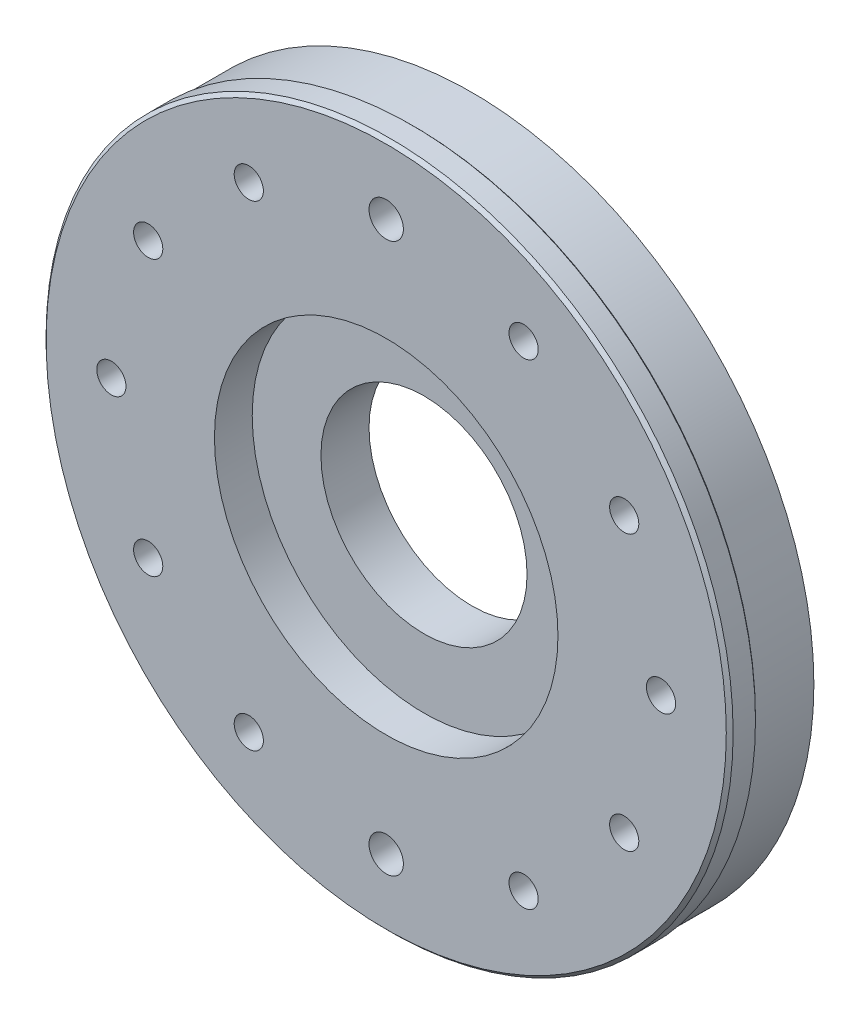
ISO-10303-21;
HEADER;
FILE_DESCRIPTION(('STEP AP214'),'2;1');
FILE_NAME('part.step','',(''),(''),'','','');
FILE_SCHEMA(('AUTOMOTIVE_DESIGN { 1 0 10303 214 1 1 1 1 }'));
ENDSEC;
DATA;
#1=APPLICATION_CONTEXT('core data for automotive mechanical design processes');
#2=APPLICATION_PROTOCOL_DEFINITION('international standard','automotive_design',2000,#1);
#3=PRODUCT_CONTEXT('',#1,'mechanical');
#4=PRODUCT('Part','Part','',(#3));
#5=PRODUCT_RELATED_PRODUCT_CATEGORY('part','',(#4));
#6=PRODUCT_DEFINITION_FORMATION('','',#4);
#7=PRODUCT_DEFINITION_CONTEXT('part definition',#1,'design');
#8=PRODUCT_DEFINITION('design','',#6,#7);
#9=PRODUCT_DEFINITION_SHAPE('','',#8);
#10=(LENGTH_UNIT() NAMED_UNIT(*) SI_UNIT(.MILLI.,.METRE.));
#11=(NAMED_UNIT(*) PLANE_ANGLE_UNIT() SI_UNIT($,.RADIAN.));
#12=(NAMED_UNIT(*) SI_UNIT($,.STERADIAN.) SOLID_ANGLE_UNIT());
#13=UNCERTAINTY_MEASURE_WITH_UNIT(LENGTH_MEASURE(1.E-05),#10,'distance_accuracy_value','');
#14=(GEOMETRIC_REPRESENTATION_CONTEXT(3) GLOBAL_UNCERTAINTY_ASSIGNED_CONTEXT((#13)) GLOBAL_UNIT_ASSIGNED_CONTEXT((#10,
#11,#12)) REPRESENTATION_CONTEXT('',''));
#15=CARTESIAN_POINT('',(0.,0.,0.));
#16=DIRECTION('',(0.,0.,1.));
#17=DIRECTION('',(1.,0.,0.));
#18=AXIS2_PLACEMENT_3D('',#15,#16,#17);
#19=CARTESIAN_POINT('',(0.,0.,-8.));
#20=DIRECTION('',(0.,0.,1.));
#21=DIRECTION('',(1.,0.,0.));
#22=AXIS2_PLACEMENT_3D('',#19,#20,#21);
#23=CYLINDRICAL_SURFACE('',#22,100.);
#24=CARTESIAN_POINT('',(0.,0.,-7.49999999999999));
#25=DIRECTION('',(0.,0.,1.));
#26=DIRECTION('',(1.,0.,0.));
#27=AXIS2_PLACEMENT_3D('',#24,#25,#26);
#28=CIRCLE('',#27,100.);
#29=CARTESIAN_POINT('',(100.,0.,-7.49999999999999));
#30=VERTEX_POINT('',#29);
#31=EDGE_CURVE('E11',#30,#30,#28,.T.);
#32=ORIENTED_EDGE('',*,*,#31,.T.);
#33=EDGE_LOOP('',(#32));
#34=FACE_BOUND('',#33,.T.);
#35=CARTESIAN_POINT('',(0.,0.,-1.));
#36=DIRECTION('',(0.,0.,1.));
#37=DIRECTION('',(1.,0.,0.));
#38=AXIS2_PLACEMENT_3D('',#35,#36,#37);
#39=CIRCLE('',#38,100.);
#40=CARTESIAN_POINT('',(100.,0.,-1.));
#41=VERTEX_POINT('',#40);
#42=EDGE_CURVE('E46',#41,#41,#39,.F.);
#43=ORIENTED_EDGE('',*,*,#42,.T.);
#44=EDGE_LOOP('',(#43));
#45=FACE_BOUND('',#44,.T.);
#46=ADVANCED_FACE('F38',(#34,#45),#23,.T.);
#47=CARTESIAN_POINT('',(0.,0.,0.));
#48=DIRECTION('',(0.,0.,1.));
#49=DIRECTION('',(1.,0.,0.));
#50=AXIS2_PLACEMENT_3D('',#47,#48,#49);
#51=PLANE('',#50);
#52=CARTESIAN_POINT('',(-69.2820323027556,39.9999999999991,0.));
#53=DIRECTION('',(0.,0.,1.));
#54=DIRECTION('',(1.,0.,0.));
#55=AXIS2_PLACEMENT_3D('',#52,#53,#54);
#56=CIRCLE('',#55,4.25);
#57=CARTESIAN_POINT('',(-65.0320323027556,39.9999999999991,0.));
#58=VERTEX_POINT('',#57);
#59=EDGE_CURVE('E142',#58,#58,#56,.T.);
#60=ORIENTED_EDGE('',*,*,#59,.F.);
#61=EDGE_LOOP('',(#60));
#62=FACE_BOUND('',#61,.T.);
#63=CARTESIAN_POINT('',(-40.0000000000008,69.2820323027546,0.));
#64=DIRECTION('',(0.,0.,1.));
#65=DIRECTION('',(1.,0.,0.));
#66=AXIS2_PLACEMENT_3D('',#63,#64,#65);
#67=CIRCLE('',#66,4.25);
#68=CARTESIAN_POINT('',(-35.7500000000008,69.2820323027546,0.));
#69=VERTEX_POINT('',#68);
#70=EDGE_CURVE('E132',#69,#69,#67,.T.);
#71=ORIENTED_EDGE('',*,*,#70,.F.);
#72=EDGE_LOOP('',(#71));
#73=FACE_BOUND('',#72,.T.);
#74=CARTESIAN_POINT('',(39.9999999999994,69.2820323027555,0.));
#75=DIRECTION('',(0.,0.,1.));
#76=DIRECTION('',(1.,0.,0.));
#77=AXIS2_PLACEMENT_3D('',#74,#75,#76);
#78=CIRCLE('',#77,4.25);
#79=CARTESIAN_POINT('',(44.2499999999994,69.2820323027555,0.));
#80=VERTEX_POINT('',#79);
#81=EDGE_CURVE('E129',#80,#80,#78,.T.);
#82=ORIENTED_EDGE('',*,*,#81,.F.);
#83=EDGE_LOOP('',(#82));
#84=FACE_BOUND('',#83,.T.);
#85=CARTESIAN_POINT('',(69.2820323027548,40.0000000000006,0.));
#86=DIRECTION('',(0.,0.,1.));
#87=DIRECTION('',(1.,0.,0.));
#88=AXIS2_PLACEMENT_3D('',#85,#86,#87);
#89=CIRCLE('',#88,4.25);
#90=CARTESIAN_POINT('',(73.5320323027548,40.0000000000006,0.));
#91=VERTEX_POINT('',#90);
#92=EDGE_CURVE('E126',#91,#91,#89,.T.);
#93=ORIENTED_EDGE('',*,*,#92,.F.);
#94=EDGE_LOOP('',(#93));
#95=FACE_BOUND('',#94,.T.);
#96=CARTESIAN_POINT('',(80.,5.58637337777501E-13,0.));
#97=DIRECTION('',(0.,0.,1.));
#98=DIRECTION('',(1.,0.,0.));
#99=AXIS2_PLACEMENT_3D('',#96,#97,#98);
#100=CIRCLE('',#99,4.25);
#101=CARTESIAN_POINT('',(84.25,5.58637337777501E-13,0.));
#102=VERTEX_POINT('',#101);
#103=EDGE_CURVE('E122',#102,#102,#100,.T.);
#104=ORIENTED_EDGE('',*,*,#103,.F.);
#105=EDGE_LOOP('',(#104));
#106=FACE_BOUND('',#105,.T.);
#107=CARTESIAN_POINT('',(69.2820323027553,-39.9999999999996,0.));
#108=DIRECTION('',(0.,0.,1.));
#109=DIRECTION('',(1.,0.,0.));
#110=AXIS2_PLACEMENT_3D('',#107,#108,#109);
#111=CIRCLE('',#110,4.25);
#112=CARTESIAN_POINT('',(73.5320323027553,-39.9999999999996,0.));
#113=VERTEX_POINT('',#112);
#114=EDGE_CURVE('E118',#113,#113,#111,.T.);
#115=ORIENTED_EDGE('',*,*,#114,.F.);
#116=EDGE_LOOP('',(#115));
#117=FACE_BOUND('',#116,.T.);
#118=CARTESIAN_POINT('',(40.0000000000003,-69.2820323027549,0.));
#119=DIRECTION('',(0.,0.,1.));
#120=DIRECTION('',(1.,0.,0.));
#121=AXIS2_PLACEMENT_3D('',#118,#119,#120);
#122=CIRCLE('',#121,4.25);
#123=CARTESIAN_POINT('',(44.2500000000003,-69.2820323027549,0.));
#124=VERTEX_POINT('',#123);
#125=EDGE_CURVE('E114',#124,#124,#122,.T.);
#126=ORIENTED_EDGE('',*,*,#125,.F.);
#127=EDGE_LOOP('',(#126));
#128=FACE_BOUND('',#127,.T.);
#129=CARTESIAN_POINT('',(-39.9999999999998,-69.2820323027552,0.));
#130=DIRECTION('',(0.,0.,1.));
#131=DIRECTION('',(1.,0.,0.));
#132=AXIS2_PLACEMENT_3D('',#129,#130,#131);
#133=CIRCLE('',#132,4.25);
#134=CARTESIAN_POINT('',(-35.7499999999998,-69.2820323027552,0.));
#135=VERTEX_POINT('',#134);
#136=EDGE_CURVE('E110',#135,#135,#133,.T.);
#137=ORIENTED_EDGE('',*,*,#136,.F.);
#138=EDGE_LOOP('',(#137));
#139=FACE_BOUND('',#138,.T.);
#140=CARTESIAN_POINT('',(-69.2820323027551,-40.0000000000001,0.));
#141=DIRECTION('',(0.,0.,1.));
#142=DIRECTION('',(1.,0.,0.));
#143=AXIS2_PLACEMENT_3D('',#140,#141,#142);
#144=CIRCLE('',#143,4.25);
#145=CARTESIAN_POINT('',(-65.032032302755,-40.0000000000001,0.));
#146=VERTEX_POINT('',#145);
#147=EDGE_CURVE('E106',#146,#146,#144,.T.);
#148=ORIENTED_EDGE('',*,*,#147,.F.);
#149=EDGE_LOOP('',(#148));
#150=FACE_BOUND('',#149,.T.);
#151=CARTESIAN_POINT('',(-80.,0.,0.));
#152=DIRECTION('',(0.,0.,1.));
#153=DIRECTION('',(1.,0.,0.));
#154=AXIS2_PLACEMENT_3D('',#151,#152,#153);
#155=CIRCLE('',#154,4.25);
#156=CARTESIAN_POINT('',(-75.75,0.,0.));
#157=VERTEX_POINT('',#156);
#158=EDGE_CURVE('E70',#157,#157,#155,.T.);
#159=ORIENTED_EDGE('',*,*,#158,.F.);
#160=EDGE_LOOP('',(#159));
#161=FACE_BOUND('',#160,.T.);
#162=CARTESIAN_POINT('',(0.,80.,0.));
#163=DIRECTION('',(0.,0.,1.));
#164=DIRECTION('',(1.,0.,0.));
#165=AXIS2_PLACEMENT_3D('',#162,#163,#164);
#166=CIRCLE('',#165,5.);
#167=CARTESIAN_POINT('',(5.,80.,0.));
#168=VERTEX_POINT('',#167);
#169=EDGE_CURVE('E63',#168,#168,#166,.T.);
#170=ORIENTED_EDGE('',*,*,#169,.F.);
#171=EDGE_LOOP('',(#170));
#172=FACE_BOUND('',#171,.T.);
#173=CARTESIAN_POINT('',(0.,-80.,0.));
#174=DIRECTION('',(0.,0.,1.));
#175=DIRECTION('',(1.,0.,0.));
#176=AXIS2_PLACEMENT_3D('',#173,#174,#175);
#177=CIRCLE('',#176,5.);
#178=CARTESIAN_POINT('',(5.,-80.,0.));
#179=VERTEX_POINT('',#178);
#180=EDGE_CURVE('E77',#179,#179,#177,.T.);
#181=ORIENTED_EDGE('',*,*,#180,.F.);
#182=EDGE_LOOP('',(#181));
#183=FACE_BOUND('',#182,.T.);
#184=CARTESIAN_POINT('',(0.,0.,0.));
#185=DIRECTION('',(0.,0.,1.));
#186=DIRECTION('',(1.,0.,0.));
#187=AXIS2_PLACEMENT_3D('',#184,#185,#186);
#188=CIRCLE('',#187,50.);
#189=CARTESIAN_POINT('',(50.,0.,0.));
#190=VERTEX_POINT('',#189);
#191=EDGE_CURVE('E86',#190,#190,#188,.T.);
#192=ORIENTED_EDGE('',*,*,#191,.F.);
#193=EDGE_LOOP('',(#192));
#194=FACE_BOUND('',#193,.T.);
#195=CARTESIAN_POINT('',(0.,0.,0.));
#196=DIRECTION('',(0.,0.,1.));
#197=DIRECTION('',(1.,0.,0.));
#198=AXIS2_PLACEMENT_3D('',#195,#196,#197);
#199=CIRCLE('',#198,99.);
#200=CARTESIAN_POINT('',(99.,0.,0.));
#201=VERTEX_POINT('',#200);
#202=EDGE_CURVE('E98',#201,#201,#199,.T.);
#203=ORIENTED_EDGE('',*,*,#202,.T.);
#204=EDGE_LOOP('',(#203));
#205=FACE_BOUND('',#204,.T.);
#206=ADVANCED_FACE('F159',(#62,#73,#84,#95,#106,#117,#128,#139,#150,#161,#172,#183,#194,#205),
#51,.T.);
#207=CARTESIAN_POINT('',(0.,0.,-25.));
#208=DIRECTION('',(0.,0.,1.));
#209=DIRECTION('',(1.,0.,0.));
#210=AXIS2_PLACEMENT_3D('',#207,#208,#209);
#211=CYLINDRICAL_SURFACE('',#210,99.5);
#212=CARTESIAN_POINT('',(0.,0.,-25.));
#213=DIRECTION('',(0.,0.,-1.));
#214=DIRECTION('',(-1.,0.,0.));
#215=AXIS2_PLACEMENT_3D('',#212,#213,#214);
#216=CIRCLE('',#215,99.5);
#217=CARTESIAN_POINT('',(-99.5,0.,-25.));
#218=VERTEX_POINT('',#217);
#219=EDGE_CURVE('E92',#218,#218,#216,.T.);
#220=ORIENTED_EDGE('',*,*,#219,.F.);
#221=EDGE_LOOP('',(#220));
#222=FACE_BOUND('',#221,.T.);
#223=CARTESIAN_POINT('',(0.,0.,-8.));
#224=DIRECTION('',(0.,0.,1.));
#225=DIRECTION('',(1.,0.,0.));
#226=AXIS2_PLACEMENT_3D('',#223,#224,#225);
#227=CIRCLE('',#226,99.5);
#228=CARTESIAN_POINT('',(99.5,0.,-8.));
#229=VERTEX_POINT('',#228);
#230=EDGE_CURVE('E95',#229,#229,#227,.F.);
#231=ORIENTED_EDGE('',*,*,#230,.T.);
#232=EDGE_LOOP('',(#231));
#233=FACE_BOUND('',#232,.T.);
#234=ADVANCED_FACE('F162',(#222,#233),#211,.T.);
#235=CARTESIAN_POINT('',(0.,0.,-25.));
#236=DIRECTION('',(0.,0.,-1.));
#237=DIRECTION('',(-1.,0.,0.));
#238=AXIS2_PLACEMENT_3D('',#235,#236,#237);
#239=PLANE('',#238);
#240=CARTESIAN_POINT('',(-69.2820323027556,39.9999999999991,-25.));
#241=DIRECTION('',(0.,0.,-1.));
#242=DIRECTION('',(-1.,0.,0.));
#243=AXIS2_PLACEMENT_3D('',#240,#241,#242);
#244=CIRCLE('',#243,4.25);
#245=CARTESIAN_POINT('',(-73.5320323027556,39.9999999999991,-25.));
#246=VERTEX_POINT('',#245);
#247=EDGE_CURVE('E41',#246,#246,#244,.T.);
#248=ORIENTED_EDGE('',*,*,#247,.F.);
#249=EDGE_LOOP('',(#248));
#250=FACE_BOUND('',#249,.T.);
#251=CARTESIAN_POINT('',(-40.0000000000008,69.2820323027546,-25.));
#252=DIRECTION('',(0.,0.,-1.));
#253=DIRECTION('',(-1.,0.,0.));
#254=AXIS2_PLACEMENT_3D('',#251,#252,#253);
#255=CIRCLE('',#254,4.25);
#256=CARTESIAN_POINT('',(-44.2500000000008,69.2820323027546,-25.));
#257=VERTEX_POINT('',#256);
#258=EDGE_CURVE('E130',#257,#257,#255,.T.);
#259=ORIENTED_EDGE('',*,*,#258,.F.);
#260=EDGE_LOOP('',(#259));
#261=FACE_BOUND('',#260,.T.);
#262=CARTESIAN_POINT('',(39.9999999999994,69.2820323027555,-25.));
#263=DIRECTION('',(0.,0.,-1.));
#264=DIRECTION('',(-1.,0.,0.));
#265=AXIS2_PLACEMENT_3D('',#262,#263,#264);
#266=CIRCLE('',#265,4.25);
#267=CARTESIAN_POINT('',(35.7499999999994,69.2820323027555,-25.));
#268=VERTEX_POINT('',#267);
#269=EDGE_CURVE('E127',#268,#268,#266,.T.);
#270=ORIENTED_EDGE('',*,*,#269,.F.);
#271=EDGE_LOOP('',(#270));
#272=FACE_BOUND('',#271,.T.);
#273=CARTESIAN_POINT('',(69.2820323027548,40.0000000000006,-25.));
#274=DIRECTION('',(0.,0.,-1.));
#275=DIRECTION('',(-1.,0.,0.));
#276=AXIS2_PLACEMENT_3D('',#273,#274,#275);
#277=CIRCLE('',#276,4.25);
#278=CARTESIAN_POINT('',(65.0320323027548,40.0000000000006,-25.));
#279=VERTEX_POINT('',#278);
#280=EDGE_CURVE('E123',#279,#279,#277,.T.);
#281=ORIENTED_EDGE('',*,*,#280,.F.);
#282=EDGE_LOOP('',(#281));
#283=FACE_BOUND('',#282,.T.);
#284=CARTESIAN_POINT('',(80.,5.58637337777501E-13,-25.));
#285=DIRECTION('',(0.,0.,-1.));
#286=DIRECTION('',(-1.,0.,0.));
#287=AXIS2_PLACEMENT_3D('',#284,#285,#286);
#288=CIRCLE('',#287,4.25);
#289=CARTESIAN_POINT('',(75.75,5.58637337777501E-13,-25.));
#290=VERTEX_POINT('',#289);
#291=EDGE_CURVE('E119',#290,#290,#288,.T.);
#292=ORIENTED_EDGE('',*,*,#291,.F.);
#293=EDGE_LOOP('',(#292));
#294=FACE_BOUND('',#293,.T.);
#295=CARTESIAN_POINT('',(69.2820323027553,-39.9999999999996,-25.));
#296=DIRECTION('',(0.,0.,-1.));
#297=DIRECTION('',(-1.,0.,0.));
#298=AXIS2_PLACEMENT_3D('',#295,#296,#297);
#299=CIRCLE('',#298,4.25);
#300=CARTESIAN_POINT('',(65.0320323027553,-39.9999999999996,-25.));
#301=VERTEX_POINT('',#300);
#302=EDGE_CURVE('E115',#301,#301,#299,.T.);
#303=ORIENTED_EDGE('',*,*,#302,.F.);
#304=EDGE_LOOP('',(#303));
#305=FACE_BOUND('',#304,.T.);
#306=CARTESIAN_POINT('',(40.0000000000003,-69.2820323027549,-25.));
#307=DIRECTION('',(0.,0.,-1.));
#308=DIRECTION('',(-1.,0.,0.));
#309=AXIS2_PLACEMENT_3D('',#306,#307,#308);
#310=CIRCLE('',#309,4.25);
#311=CARTESIAN_POINT('',(35.7500000000003,-69.2820323027549,-25.));
#312=VERTEX_POINT('',#311);
#313=EDGE_CURVE('E111',#312,#312,#310,.T.);
#314=ORIENTED_EDGE('',*,*,#313,.F.);
#315=EDGE_LOOP('',(#314));
#316=FACE_BOUND('',#315,.T.);
#317=CARTESIAN_POINT('',(-39.9999999999998,-69.2820323027552,-25.));
#318=DIRECTION('',(0.,0.,-1.));
#319=DIRECTION('',(-1.,0.,0.));
#320=AXIS2_PLACEMENT_3D('',#317,#318,#319);
#321=CIRCLE('',#320,4.25);
#322=CARTESIAN_POINT('',(-44.2499999999998,-69.2820323027552,-25.));
#323=VERTEX_POINT('',#322);
#324=EDGE_CURVE('E107',#323,#323,#321,.T.);
#325=ORIENTED_EDGE('',*,*,#324,.F.);
#326=EDGE_LOOP('',(#325));
#327=FACE_BOUND('',#326,.T.);
#328=CARTESIAN_POINT('',(-69.2820323027551,-40.0000000000001,-25.));
#329=DIRECTION('',(0.,0.,-1.));
#330=DIRECTION('',(-1.,0.,0.));
#331=AXIS2_PLACEMENT_3D('',#328,#329,#330);
#332=CIRCLE('',#331,4.25);
#333=CARTESIAN_POINT('',(-73.532032302755,-40.0000000000001,-25.));
#334=VERTEX_POINT('',#333);
#335=EDGE_CURVE('E103',#334,#334,#332,.T.);
#336=ORIENTED_EDGE('',*,*,#335,.F.);
#337=EDGE_LOOP('',(#336));
#338=FACE_BOUND('',#337,.T.);
#339=CARTESIAN_POINT('',(-80.,0.,-25.));
#340=DIRECTION('',(0.,0.,-1.));
#341=DIRECTION('',(-1.,0.,0.));
#342=AXIS2_PLACEMENT_3D('',#339,#340,#341);
#343=CIRCLE('',#342,4.25);
#344=CARTESIAN_POINT('',(-84.25,0.,-25.));
#345=VERTEX_POINT('',#344);
#346=EDGE_CURVE('E64',#345,#345,#343,.T.);
#347=ORIENTED_EDGE('',*,*,#346,.F.);
#348=EDGE_LOOP('',(#347));
#349=FACE_BOUND('',#348,.T.);
#350=CARTESIAN_POINT('',(0.,0.,-25.));
#351=DIRECTION('',(0.,0.,1.));
#352=DIRECTION('',(1.,0.,0.));
#353=AXIS2_PLACEMENT_3D('',#350,#351,#352);
#354=CIRCLE('',#353,30.);
#355=CARTESIAN_POINT('',(30.,0.,-25.));
#356=VERTEX_POINT('',#355);
#357=EDGE_CURVE('E83',#356,#356,#354,.T.);
#358=ORIENTED_EDGE('',*,*,#357,.T.);
#359=EDGE_LOOP('',(#358));
#360=FACE_BOUND('',#359,.T.);
#361=ORIENTED_EDGE('',*,*,#219,.T.);
#362=EDGE_LOOP('',(#361));
#363=FACE_BOUND('',#362,.T.);
#364=ADVANCED_FACE('F178',(#250,#261,#272,#283,#294,#305,#316,#327,#338,#349,#360,#363),#239,.T.);
#365=CARTESIAN_POINT('',(0.,0.,0.));
#366=DIRECTION('',(0.,0.,-1.));
#367=DIRECTION('',(-1.,0.,0.));
#368=AXIS2_PLACEMENT_3D('',#365,#366,#367);
#369=CONICAL_SURFACE('',#368,99.,0.785398163397448);
#370=ORIENTED_EDGE('',*,*,#42,.F.);
#371=EDGE_LOOP('',(#370));
#372=FACE_BOUND('',#371,.T.);
#373=ORIENTED_EDGE('',*,*,#202,.F.);
#374=EDGE_LOOP('',(#373));
#375=FACE_BOUND('',#374,.T.);
#376=ADVANCED_FACE('F175',(#372,#375),#369,.T.);
#377=CARTESIAN_POINT('',(0.,0.,-7.49999999999999));
#378=DIRECTION('',(0.,0.,1.));
#379=DIRECTION('',(1.,0.,0.));
#380=AXIS2_PLACEMENT_3D('',#377,#378,#379);
#381=CONICAL_SURFACE('',#380,100.,0.785398163397441);
#382=ORIENTED_EDGE('',*,*,#230,.F.);
#383=EDGE_LOOP('',(#382));
#384=FACE_BOUND('',#383,.T.);
#385=ORIENTED_EDGE('',*,*,#31,.F.);
#386=EDGE_LOOP('',(#385));
#387=FACE_BOUND('',#386,.T.);
#388=ADVANCED_FACE('F177',(#384,#387),#381,.T.);
#389=CARTESIAN_POINT('',(0.,0.,-11.));
#390=DIRECTION('',(0.,0.,1.));
#391=DIRECTION('',(1.,0.,0.));
#392=AXIS2_PLACEMENT_3D('',#389,#390,#391);
#393=CYLINDRICAL_SURFACE('',#392,50.);
#394=CARTESIAN_POINT('',(0.,0.,-11.));
#395=DIRECTION('',(0.,0.,1.));
#396=DIRECTION('',(1.,0.,0.));
#397=AXIS2_PLACEMENT_3D('',#394,#395,#396);
#398=CIRCLE('',#397,50.);
#399=CARTESIAN_POINT('',(50.,0.,-11.));
#400=VERTEX_POINT('',#399);
#401=EDGE_CURVE('E89',#400,#400,#398,.T.);
#402=ORIENTED_EDGE('',*,*,#401,.F.);
#403=EDGE_LOOP('',(#402));
#404=FACE_BOUND('',#403,.T.);
#405=ORIENTED_EDGE('',*,*,#191,.T.);
#406=EDGE_LOOP('',(#405));
#407=FACE_BOUND('',#406,.T.);
#408=ADVANCED_FACE('F185',(#404,#407),#393,.F.);
#409=CARTESIAN_POINT('',(0.,0.,-11.));
#410=DIRECTION('',(0.,0.,1.));
#411=DIRECTION('',(1.,0.,0.));
#412=AXIS2_PLACEMENT_3D('',#409,#410,#411);
#413=PLANE('',#412);
#414=CARTESIAN_POINT('',(0.,0.,-11.));
#415=DIRECTION('',(0.,0.,1.));
#416=DIRECTION('',(1.,0.,0.));
#417=AXIS2_PLACEMENT_3D('',#414,#415,#416);
#418=CIRCLE('',#417,30.);
#419=CARTESIAN_POINT('',(30.,0.,-11.));
#420=VERTEX_POINT('',#419);
#421=EDGE_CURVE('E80',#420,#420,#418,.T.);
#422=ORIENTED_EDGE('',*,*,#421,.F.);
#423=EDGE_LOOP('',(#422));
#424=FACE_BOUND('',#423,.T.);
#425=ORIENTED_EDGE('',*,*,#401,.T.);
#426=EDGE_LOOP('',(#425));
#427=FACE_BOUND('',#426,.T.);
#428=ADVANCED_FACE('F326',(#424,#427),#413,.T.);
#429=CARTESIAN_POINT('',(0.,0.,-25.));
#430=DIRECTION('',(0.,0.,1.));
#431=DIRECTION('',(1.,0.,0.));
#432=AXIS2_PLACEMENT_3D('',#429,#430,#431);
#433=CYLINDRICAL_SURFACE('',#432,30.);
#434=ORIENTED_EDGE('',*,*,#357,.F.);
#435=EDGE_LOOP('',(#434));
#436=FACE_BOUND('',#435,.T.);
#437=ORIENTED_EDGE('',*,*,#421,.T.);
#438=EDGE_LOOP('',(#437));
#439=FACE_BOUND('',#438,.T.);
#440=ADVANCED_FACE('F322',(#436,#439),#433,.F.);
#441=CARTESIAN_POINT('',(0.,-80.,0.));
#442=DIRECTION('',(0.,0.,1.));
#443=DIRECTION('',(1.,0.,0.));
#444=AXIS2_PLACEMENT_3D('',#441,#442,#443);
#445=CYLINDRICAL_SURFACE('',#444,5.);
#446=CARTESIAN_POINT('',(0.,-80.,-20.));
#447=DIRECTION('',(0.,0.,1.));
#448=DIRECTION('',(1.,0.,0.));
#449=AXIS2_PLACEMENT_3D('',#446,#447,#448);
#450=CIRCLE('',#449,5.);
#451=CARTESIAN_POINT('',(5.,-80.,-20.));
#452=VERTEX_POINT('',#451);
#453=EDGE_CURVE('E67',#452,#452,#450,.T.);
#454=ORIENTED_EDGE('',*,*,#453,.F.);
#455=EDGE_LOOP('',(#454));
#456=FACE_BOUND('',#455,.T.);
#457=ORIENTED_EDGE('',*,*,#180,.T.);
#458=EDGE_LOOP('',(#457));
#459=FACE_BOUND('',#458,.T.);
#460=ADVANCED_FACE('F319',(#456,#459),#445,.F.);
#461=CARTESIAN_POINT('',(0.,-80.,-20.));
#462=DIRECTION('',(0.,0.,1.));
#463=DIRECTION('',(1.,0.,0.));
#464=AXIS2_PLACEMENT_3D('',#461,#462,#463);
#465=CONICAL_SURFACE('',#464,5.,1.02974425867665);
#466=CARTESIAN_POINT('',(0.,-80.,-23.0043030951378));
#467=VERTEX_POINT('',#466);
#468=VERTEX_LOOP('',#467);
#469=FACE_BOUND('',#468,.T.);
#470=ORIENTED_EDGE('',*,*,#453,.T.);
#471=EDGE_LOOP('',(#470));
#472=FACE_BOUND('',#471,.T.);
#473=ADVANCED_FACE('F316',(#469,#472),#465,.F.);
#474=CARTESIAN_POINT('',(0.,80.,0.));
#475=DIRECTION('',(0.,0.,1.));
#476=DIRECTION('',(1.,0.,0.));
#477=AXIS2_PLACEMENT_3D('',#474,#475,#476);
#478=CYLINDRICAL_SURFACE('',#477,5.);
#479=CARTESIAN_POINT('',(0.,80.,-20.));
#480=DIRECTION('',(0.,0.,1.));
#481=DIRECTION('',(1.,0.,0.));
#482=AXIS2_PLACEMENT_3D('',#479,#480,#481);
#483=CIRCLE('',#482,5.);
#484=CARTESIAN_POINT('',(5.,80.,-20.));
#485=VERTEX_POINT('',#484);
#486=EDGE_CURVE('E61',#485,#485,#483,.T.);
#487=ORIENTED_EDGE('',*,*,#486,.F.);
#488=EDGE_LOOP('',(#487));
#489=FACE_BOUND('',#488,.T.);
#490=ORIENTED_EDGE('',*,*,#169,.T.);
#491=EDGE_LOOP('',(#490));
#492=FACE_BOUND('',#491,.T.);
#493=ADVANCED_FACE('F57',(#489,#492),#478,.F.);
#494=CARTESIAN_POINT('',(0.,80.,-20.));
#495=DIRECTION('',(0.,0.,1.));
#496=DIRECTION('',(1.,0.,0.));
#497=AXIS2_PLACEMENT_3D('',#494,#495,#496);
#498=CONICAL_SURFACE('',#497,5.,1.02974425867665);
#499=CARTESIAN_POINT('',(0.,80.,-23.0043030951378));
#500=VERTEX_POINT('',#499);
#501=VERTEX_LOOP('',#500);
#502=FACE_BOUND('',#501,.T.);
#503=ORIENTED_EDGE('',*,*,#486,.T.);
#504=EDGE_LOOP('',(#503));
#505=FACE_BOUND('',#504,.T.);
#506=ADVANCED_FACE('F53',(#502,#505),#498,.F.);
#507=CARTESIAN_POINT('',(-80.,0.,0.));
#508=DIRECTION('',(0.,0.,1.));
#509=DIRECTION('',(1.,0.,0.));
#510=AXIS2_PLACEMENT_3D('',#507,#508,#509);
#511=CYLINDRICAL_SURFACE('',#510,4.25);
#512=ORIENTED_EDGE('',*,*,#346,.T.);
#513=EDGE_LOOP('',(#512));
#514=FACE_BOUND('',#513,.T.);
#515=ORIENTED_EDGE('',*,*,#158,.T.);
#516=EDGE_LOOP('',(#515));
#517=FACE_BOUND('',#516,.T.);
#518=ADVANCED_FACE('F56',(#514,#517),#511,.F.);
#519=CARTESIAN_POINT('',(-69.2820323027551,-40.0000000000001,0.));
#520=DIRECTION('',(0.,0.,1.));
#521=DIRECTION('',(1.,0.,0.));
#522=AXIS2_PLACEMENT_3D('',#519,#520,#521);
#523=CYLINDRICAL_SURFACE('',#522,4.25);
#524=ORIENTED_EDGE('',*,*,#335,.T.);
#525=EDGE_LOOP('',(#524));
#526=FACE_BOUND('',#525,.T.);
#527=ORIENTED_EDGE('',*,*,#147,.T.);
#528=EDGE_LOOP('',(#527));
#529=FACE_BOUND('',#528,.T.);
#530=ADVANCED_FACE('F157',(#526,#529),#523,.F.);
#531=CARTESIAN_POINT('',(-39.9999999999998,-69.2820323027552,0.));
#532=DIRECTION('',(0.,0.,1.));
#533=DIRECTION('',(1.,0.,0.));
#534=AXIS2_PLACEMENT_3D('',#531,#532,#533);
#535=CYLINDRICAL_SURFACE('',#534,4.25);
#536=ORIENTED_EDGE('',*,*,#324,.T.);
#537=EDGE_LOOP('',(#536));
#538=FACE_BOUND('',#537,.T.);
#539=ORIENTED_EDGE('',*,*,#136,.T.);
#540=EDGE_LOOP('',(#539));
#541=FACE_BOUND('',#540,.T.);
#542=ADVANCED_FACE('F225',(#538,#541),#535,.F.);
#543=CARTESIAN_POINT('',(40.0000000000003,-69.2820323027549,0.));
#544=DIRECTION('',(0.,0.,1.));
#545=DIRECTION('',(1.,0.,0.));
#546=AXIS2_PLACEMENT_3D('',#543,#544,#545);
#547=CYLINDRICAL_SURFACE('',#546,4.25);
#548=ORIENTED_EDGE('',*,*,#313,.T.);
#549=EDGE_LOOP('',(#548));
#550=FACE_BOUND('',#549,.T.);
#551=ORIENTED_EDGE('',*,*,#125,.T.);
#552=EDGE_LOOP('',(#551));
#553=FACE_BOUND('',#552,.T.);
#554=ADVANCED_FACE('F237',(#550,#553),#547,.F.);
#555=CARTESIAN_POINT('',(69.2820323027553,-39.9999999999996,0.));
#556=DIRECTION('',(0.,0.,1.));
#557=DIRECTION('',(1.,0.,0.));
#558=AXIS2_PLACEMENT_3D('',#555,#556,#557);
#559=CYLINDRICAL_SURFACE('',#558,4.25);
#560=ORIENTED_EDGE('',*,*,#302,.T.);
#561=EDGE_LOOP('',(#560));
#562=FACE_BOUND('',#561,.T.);
#563=ORIENTED_EDGE('',*,*,#114,.T.);
#564=EDGE_LOOP('',(#563));
#565=FACE_BOUND('',#564,.T.);
#566=ADVANCED_FACE('F247',(#562,#565),#559,.F.);
#567=CARTESIAN_POINT('',(80.,5.58637337777501E-13,0.));
#568=DIRECTION('',(0.,0.,1.));
#569=DIRECTION('',(1.,0.,0.));
#570=AXIS2_PLACEMENT_3D('',#567,#568,#569);
#571=CYLINDRICAL_SURFACE('',#570,4.25);
#572=ORIENTED_EDGE('',*,*,#291,.T.);
#573=EDGE_LOOP('',(#572));
#574=FACE_BOUND('',#573,.T.);
#575=ORIENTED_EDGE('',*,*,#103,.T.);
#576=EDGE_LOOP('',(#575));
#577=FACE_BOUND('',#576,.T.);
#578=ADVANCED_FACE('F257',(#574,#577),#571,.F.);
#579=CARTESIAN_POINT('',(69.2820323027548,40.0000000000006,0.));
#580=DIRECTION('',(0.,0.,1.));
#581=DIRECTION('',(1.,0.,0.));
#582=AXIS2_PLACEMENT_3D('',#579,#580,#581);
#583=CYLINDRICAL_SURFACE('',#582,4.25);
#584=ORIENTED_EDGE('',*,*,#280,.T.);
#585=EDGE_LOOP('',(#584));
#586=FACE_BOUND('',#585,.T.);
#587=ORIENTED_EDGE('',*,*,#92,.T.);
#588=EDGE_LOOP('',(#587));
#589=FACE_BOUND('',#588,.T.);
#590=ADVANCED_FACE('F267',(#586,#589),#583,.F.);
#591=CARTESIAN_POINT('',(39.9999999999994,69.2820323027555,0.));
#592=DIRECTION('',(0.,0.,1.));
#593=DIRECTION('',(1.,0.,0.));
#594=AXIS2_PLACEMENT_3D('',#591,#592,#593);
#595=CYLINDRICAL_SURFACE('',#594,4.25);
#596=ORIENTED_EDGE('',*,*,#269,.T.);
#597=EDGE_LOOP('',(#596));
#598=FACE_BOUND('',#597,.T.);
#599=ORIENTED_EDGE('',*,*,#81,.T.);
#600=EDGE_LOOP('',(#599));
#601=FACE_BOUND('',#600,.T.);
#602=ADVANCED_FACE('F277',(#598,#601),#595,.F.);
#603=CARTESIAN_POINT('',(-40.0000000000008,69.2820323027546,0.));
#604=DIRECTION('',(0.,0.,1.));
#605=DIRECTION('',(1.,0.,0.));
#606=AXIS2_PLACEMENT_3D('',#603,#604,#605);
#607=CYLINDRICAL_SURFACE('',#606,4.25);
#608=ORIENTED_EDGE('',*,*,#258,.T.);
#609=EDGE_LOOP('',(#608));
#610=FACE_BOUND('',#609,.T.);
#611=ORIENTED_EDGE('',*,*,#70,.T.);
#612=EDGE_LOOP('',(#611));
#613=FACE_BOUND('',#612,.T.);
#614=ADVANCED_FACE('F287',(#610,#613),#607,.F.);
#615=CARTESIAN_POINT('',(-69.2820323027556,39.9999999999991,0.));
#616=DIRECTION('',(0.,0.,1.));
#617=DIRECTION('',(1.,0.,0.));
#618=AXIS2_PLACEMENT_3D('',#615,#616,#617);
#619=CYLINDRICAL_SURFACE('',#618,4.25);
#620=ORIENTED_EDGE('',*,*,#247,.T.);
#621=EDGE_LOOP('',(#620));
#622=FACE_BOUND('',#621,.T.);
#623=ORIENTED_EDGE('',*,*,#59,.T.);
#624=EDGE_LOOP('',(#623));
#625=FACE_BOUND('',#624,.T.);
#626=ADVANCED_FACE('F297',(#622,#625),#619,.F.);
#627=CLOSED_SHELL('',(#46,#206,#234,#364,#376,#388,#408,#428,#440,#460,#473,#493,#506,#518,#530,
#542,#554,#566,#578,#590,#602,#614,#626));
#628=MANIFOLD_SOLID_BREP('B2',#627);
#629=ADVANCED_BREP_SHAPE_REPRESENTATION('',(#18,#628),#14);
#630=SHAPE_DEFINITION_REPRESENTATION(#9,#629);
ENDSEC;
END-ISO-10303-21;
